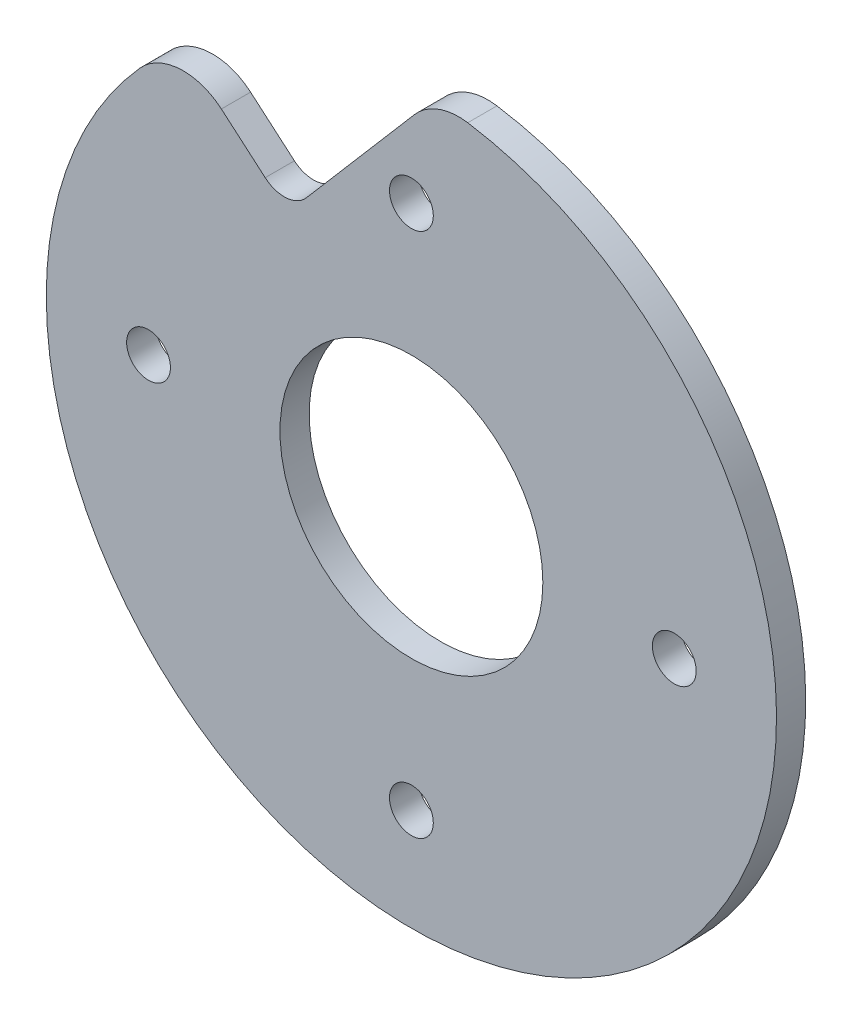
ISO-10303-21;
HEADER;
FILE_DESCRIPTION(('STEP AP214'),'2;1');
FILE_NAME('part.step','',(''),(''),'','','');
FILE_SCHEMA(('AUTOMOTIVE_DESIGN { 1 0 10303 214 1 1 1 1 }'));
ENDSEC;
DATA;
#1=APPLICATION_CONTEXT('core data for automotive mechanical design processes');
#2=APPLICATION_PROTOCOL_DEFINITION('international standard','automotive_design',2000,#1);
#3=PRODUCT_CONTEXT('',#1,'mechanical');
#4=PRODUCT('Part','Part','',(#3));
#5=PRODUCT_RELATED_PRODUCT_CATEGORY('part','',(#4));
#6=PRODUCT_DEFINITION_FORMATION('','',#4);
#7=PRODUCT_DEFINITION_CONTEXT('part definition',#1,'design');
#8=PRODUCT_DEFINITION('design','',#6,#7);
#9=PRODUCT_DEFINITION_SHAPE('','',#8);
#10=(LENGTH_UNIT() NAMED_UNIT(*) SI_UNIT(.MILLI.,.METRE.));
#11=(NAMED_UNIT(*) PLANE_ANGLE_UNIT() SI_UNIT($,.RADIAN.));
#12=(NAMED_UNIT(*) SI_UNIT($,.STERADIAN.) SOLID_ANGLE_UNIT());
#13=UNCERTAINTY_MEASURE_WITH_UNIT(LENGTH_MEASURE(1.E-05),#10,'distance_accuracy_value','');
#14=(GEOMETRIC_REPRESENTATION_CONTEXT(3) GLOBAL_UNCERTAINTY_ASSIGNED_CONTEXT((#13)) GLOBAL_UNIT_ASSIGNED_CONTEXT((#10,
#11,#12)) REPRESENTATION_CONTEXT('',''));
#15=CARTESIAN_POINT('',(0.,0.,0.));
#16=DIRECTION('',(0.,0.,1.));
#17=DIRECTION('',(1.,0.,0.));
#18=AXIS2_PLACEMENT_3D('',#15,#16,#17);
#19=CARTESIAN_POINT('',(-15.614621701814,14.0422074158317,2.));
#20=DIRECTION('',(0.,0.,1.));
#21=DIRECTION('',(1.,0.,0.));
#22=AXIS2_PLACEMENT_3D('',#19,#20,#21);
#23=PLANE('',#22);
#24=CARTESIAN_POINT('',(0.,18.,2.));
#25=DIRECTION('',(0.,0.,1.));
#26=DIRECTION('',(1.,0.,0.));
#27=AXIS2_PLACEMENT_3D('',#24,#25,#26);
#28=CIRCLE('',#27,1.5);
#29=CARTESIAN_POINT('',(1.5,18.,2.));
#30=VERTEX_POINT('',#29);
#31=EDGE_CURVE('E193',#30,#30,#28,.T.);
#32=ORIENTED_EDGE('',*,*,#31,.F.);
#33=EDGE_LOOP('',(#32));
#34=FACE_BOUND('',#33,.T.);
#35=CARTESIAN_POINT('',(18.,0.,2.));
#36=DIRECTION('',(0.,0.,1.));
#37=DIRECTION('',(1.,0.,0.));
#38=AXIS2_PLACEMENT_3D('',#35,#36,#37);
#39=CIRCLE('',#38,1.50000000000003);
#40=CARTESIAN_POINT('',(19.5,0.,2.));
#41=VERTEX_POINT('',#40);
#42=EDGE_CURVE('E205',#41,#41,#39,.T.);
#43=ORIENTED_EDGE('',*,*,#42,.F.);
#44=EDGE_LOOP('',(#43));
#45=FACE_BOUND('',#44,.T.);
#46=CARTESIAN_POINT('',(-15.614621701814,14.0422074158317,2.));
#47=DIRECTION('',(0.,0.,1.));
#48=DIRECTION('',(1.,0.,0.));
#49=AXIS2_PLACEMENT_3D('',#46,#47,#48);
#50=CIRCLE('',#49,4.);
#51=CARTESIAN_POINT('',(-13.0114883824099,17.0792614030713,2.));
#52=VERTEX_POINT('',#51);
#53=CARTESIAN_POINT('',(-18.5888353593024,16.7169135902758,2.));
#54=VERTEX_POINT('',#53);
#55=EDGE_CURVE('E129',#52,#54,#50,.T.);
#56=ORIENTED_EDGE('',*,*,#55,.T.);
#57=CARTESIAN_POINT('',(0.,0.,2.));
#58=DIRECTION('',(0.,0.,1.));
#59=DIRECTION('',(1.,0.,0.));
#60=AXIS2_PLACEMENT_3D('',#57,#58,#59);
#61=CIRCLE('',#60,25.);
#62=CARTESIAN_POINT('',(3.85745997564482,24.7006073313249,2.));
#63=VERTEX_POINT('',#62);
#64=EDGE_CURVE('E87',#54,#63,#61,.T.);
#65=ORIENTED_EDGE('',*,*,#64,.T.);
#66=CARTESIAN_POINT('',(3.24026637954127,20.748510158313,2.));
#67=DIRECTION('',(0.,0.,1.));
#68=DIRECTION('',(1.,0.,0.));
#69=AXIS2_PLACEMENT_3D('',#66,#67,#68);
#70=CIRCLE('',#69,3.99999999999999);
#71=CARTESIAN_POINT('',(0.203212392301789,23.3516434777173,2.));
#72=VERTEX_POINT('',#71);
#73=EDGE_CURVE('E100',#63,#72,#70,.T.);
#74=ORIENTED_EDGE('',*,*,#73,.T.);
#75=DIRECTION('',(-0.650783329851117,-0.759263496809831,0.));
#76=VECTOR('',#75,1.);
#77=CARTESIAN_POINT('',(0.20321239230179,23.3516434777173,2.));
#78=LINE('',#77,#76);
#79=CARTESIAN_POINT('',(-7.19118155298929,14.7246655786744,2.));
#80=VERTEX_POINT('',#79);
#81=EDGE_CURVE('E94',#72,#80,#78,.T.);
#82=ORIENTED_EDGE('',*,*,#81,.T.);
#83=CARTESIAN_POINT('',(-8.70970854660862,16.026232238377,2.));
#84=DIRECTION('',(0.,0.,-1.));
#85=DIRECTION('',(1.,0.,0.));
#86=AXIS2_PLACEMENT_3D('',#83,#84,#85);
#87=CIRCLE('',#86,1.99999999999999);
#88=CARTESIAN_POINT('',(-10.0112752063105,14.5077052447571,2.));
#89=VERTEX_POINT('',#88);
#90=EDGE_CURVE('E98',#80,#89,#87,.T.);
#91=ORIENTED_EDGE('',*,*,#90,.T.);
#92=DIRECTION('',(-0.759263496809929,0.650783329851003,0.));
#93=VECTOR('',#92,1.);
#94=CARTESIAN_POINT('',(-10.0112752063105,14.5077052447571,2.));
#95=LINE('',#94,#93);
#96=EDGE_CURVE('E50',#89,#52,#95,.T.);
#97=ORIENTED_EDGE('',*,*,#96,.T.);
#98=EDGE_LOOP('',(#56,#65,#74,#82,#91,#97));
#99=FACE_BOUND('',#98,.T.);
#100=CARTESIAN_POINT('',(-18.,0.,2.));
#101=DIRECTION('',(0.,0.,1.));
#102=DIRECTION('',(1.,0.,0.));
#103=AXIS2_PLACEMENT_3D('',#100,#101,#102);
#104=CIRCLE('',#103,1.5);
#105=CARTESIAN_POINT('',(-16.5,0.,2.));
#106=VERTEX_POINT('',#105);
#107=EDGE_CURVE('E122',#106,#106,#104,.T.);
#108=ORIENTED_EDGE('',*,*,#107,.F.);
#109=EDGE_LOOP('',(#108));
#110=FACE_BOUND('',#109,.T.);
#111=CARTESIAN_POINT('',(0.,0.,2.));
#112=DIRECTION('',(0.,0.,1.));
#113=DIRECTION('',(1.,0.,0.));
#114=AXIS2_PLACEMENT_3D('',#111,#112,#113);
#115=CIRCLE('',#114,9.);
#116=CARTESIAN_POINT('',(9.,0.,2.));
#117=VERTEX_POINT('',#116);
#118=EDGE_CURVE('E199',#117,#117,#115,.T.);
#119=ORIENTED_EDGE('',*,*,#118,.F.);
#120=EDGE_LOOP('',(#119));
#121=FACE_BOUND('',#120,.T.);
#122=CARTESIAN_POINT('',(0.,-18.,2.));
#123=DIRECTION('',(0.,0.,1.));
#124=DIRECTION('',(1.,0.,0.));
#125=AXIS2_PLACEMENT_3D('',#122,#123,#124);
#126=CIRCLE('',#125,1.5);
#127=CARTESIAN_POINT('',(1.5,-18.,2.));
#128=VERTEX_POINT('',#127);
#129=EDGE_CURVE('E184',#128,#128,#126,.T.);
#130=ORIENTED_EDGE('',*,*,#129,.F.);
#131=EDGE_LOOP('',(#130));
#132=FACE_BOUND('',#131,.T.);
#133=ADVANCED_FACE('F33',(#34,#45,#99,#110,#121,#132),#23,.T.);
#134=CARTESIAN_POINT('',(-15.614621701814,14.0422074158317,0.));
#135=DIRECTION('',(0.,0.,1.));
#136=DIRECTION('',(1.,0.,0.));
#137=AXIS2_PLACEMENT_3D('',#134,#135,#136);
#138=PLANE('',#137);
#139=CARTESIAN_POINT('',(-15.614621701814,14.0422074158317,0.));
#140=DIRECTION('',(0.,0.,1.));
#141=DIRECTION('',(1.,0.,0.));
#142=AXIS2_PLACEMENT_3D('',#139,#140,#141);
#143=CIRCLE('',#142,4.);
#144=CARTESIAN_POINT('',(-13.0114883824099,17.0792614030713,0.));
#145=VERTEX_POINT('',#144);
#146=CARTESIAN_POINT('',(-18.5888353593024,16.7169135902758,0.));
#147=VERTEX_POINT('',#146);
#148=EDGE_CURVE('E118',#145,#147,#143,.T.);
#149=ORIENTED_EDGE('',*,*,#148,.F.);
#150=DIRECTION('',(-0.759263496809929,0.650783329851003,0.));
#151=VECTOR('',#150,1.);
#152=CARTESIAN_POINT('',(-10.0112752063105,14.5077052447571,0.));
#153=LINE('',#152,#151);
#154=CARTESIAN_POINT('',(-10.0112752063105,14.5077052447571,0.));
#155=VERTEX_POINT('',#154);
#156=EDGE_CURVE('E79',#155,#145,#153,.T.);
#157=ORIENTED_EDGE('',*,*,#156,.F.);
#158=CARTESIAN_POINT('',(-8.70970854660862,16.026232238377,0.));
#159=DIRECTION('',(0.,0.,-1.));
#160=DIRECTION('',(1.,0.,0.));
#161=AXIS2_PLACEMENT_3D('',#158,#159,#160);
#162=CIRCLE('',#161,1.99999999999999);
#163=CARTESIAN_POINT('',(-7.19118155298929,14.7246655786744,0.));
#164=VERTEX_POINT('',#163);
#165=EDGE_CURVE('E73',#164,#155,#162,.T.);
#166=ORIENTED_EDGE('',*,*,#165,.F.);
#167=DIRECTION('',(-0.650783329851117,-0.759263496809831,0.));
#168=VECTOR('',#167,1.);
#169=CARTESIAN_POINT('',(0.20321239230179,23.3516434777173,0.));
#170=LINE('',#169,#168);
#171=CARTESIAN_POINT('',(0.203212392301789,23.3516434777173,0.));
#172=VERTEX_POINT('',#171);
#173=EDGE_CURVE('E108',#172,#164,#170,.T.);
#174=ORIENTED_EDGE('',*,*,#173,.F.);
#175=CARTESIAN_POINT('',(3.24026637954127,20.748510158313,0.));
#176=DIRECTION('',(0.,0.,1.));
#177=DIRECTION('',(1.,0.,0.));
#178=AXIS2_PLACEMENT_3D('',#175,#176,#177);
#179=CIRCLE('',#178,3.99999999999999);
#180=CARTESIAN_POINT('',(3.85745997564482,24.7006073313249,0.));
#181=VERTEX_POINT('',#180);
#182=EDGE_CURVE('E124',#181,#172,#179,.T.);
#183=ORIENTED_EDGE('',*,*,#182,.F.);
#184=CARTESIAN_POINT('',(0.,0.,0.));
#185=DIRECTION('',(0.,0.,1.));
#186=DIRECTION('',(1.,0.,0.));
#187=AXIS2_PLACEMENT_3D('',#184,#185,#186);
#188=CIRCLE('',#187,25.);
#189=EDGE_CURVE('E121',#147,#181,#188,.T.);
#190=ORIENTED_EDGE('',*,*,#189,.F.);
#191=EDGE_LOOP('',(#149,#157,#166,#174,#183,#190));
#192=FACE_BOUND('',#191,.T.);
#193=CARTESIAN_POINT('',(-18.,0.,0.));
#194=DIRECTION('',(0.,0.,1.));
#195=DIRECTION('',(1.,0.,0.));
#196=AXIS2_PLACEMENT_3D('',#193,#194,#195);
#197=CIRCLE('',#196,1.5);
#198=CARTESIAN_POINT('',(-16.5,0.,0.));
#199=VERTEX_POINT('',#198);
#200=EDGE_CURVE('E208',#199,#199,#197,.T.);
#201=ORIENTED_EDGE('',*,*,#200,.T.);
#202=EDGE_LOOP('',(#201));
#203=FACE_BOUND('',#202,.T.);
#204=CARTESIAN_POINT('',(18.,0.,0.));
#205=DIRECTION('',(0.,0.,1.));
#206=DIRECTION('',(1.,0.,0.));
#207=AXIS2_PLACEMENT_3D('',#204,#205,#206);
#208=CIRCLE('',#207,1.50000000000003);
#209=CARTESIAN_POINT('',(19.5,0.,0.));
#210=VERTEX_POINT('',#209);
#211=EDGE_CURVE('E202',#210,#210,#208,.T.);
#212=ORIENTED_EDGE('',*,*,#211,.T.);
#213=EDGE_LOOP('',(#212));
#214=FACE_BOUND('',#213,.T.);
#215=CARTESIAN_POINT('',(0.,0.,0.));
#216=DIRECTION('',(0.,0.,1.));
#217=DIRECTION('',(1.,0.,0.));
#218=AXIS2_PLACEMENT_3D('',#215,#216,#217);
#219=CIRCLE('',#218,9.);
#220=CARTESIAN_POINT('',(9.,0.,0.));
#221=VERTEX_POINT('',#220);
#222=EDGE_CURVE('E196',#221,#221,#219,.T.);
#223=ORIENTED_EDGE('',*,*,#222,.T.);
#224=EDGE_LOOP('',(#223));
#225=FACE_BOUND('',#224,.T.);
#226=CARTESIAN_POINT('',(0.,18.,0.));
#227=DIRECTION('',(0.,0.,1.));
#228=DIRECTION('',(1.,0.,0.));
#229=AXIS2_PLACEMENT_3D('',#226,#227,#228);
#230=CIRCLE('',#229,1.5);
#231=CARTESIAN_POINT('',(1.5,18.,0.));
#232=VERTEX_POINT('',#231);
#233=EDGE_CURVE('E190',#232,#232,#230,.T.);
#234=ORIENTED_EDGE('',*,*,#233,.T.);
#235=EDGE_LOOP('',(#234));
#236=FACE_BOUND('',#235,.T.);
#237=CARTESIAN_POINT('',(0.,-18.,0.));
#238=DIRECTION('',(0.,0.,1.));
#239=DIRECTION('',(1.,0.,0.));
#240=AXIS2_PLACEMENT_3D('',#237,#238,#239);
#241=CIRCLE('',#240,1.5);
#242=CARTESIAN_POINT('',(1.5,-18.,0.));
#243=VERTEX_POINT('',#242);
#244=EDGE_CURVE('E187',#243,#243,#241,.T.);
#245=ORIENTED_EDGE('',*,*,#244,.T.);
#246=EDGE_LOOP('',(#245));
#247=FACE_BOUND('',#246,.T.);
#248=ADVANCED_FACE('F138',(#192,#203,#214,#225,#236,#247),#138,.F.);
#249=CARTESIAN_POINT('',(-15.614621701814,14.0422074158317,2.));
#250=DIRECTION('',(0.,0.,-1.));
#251=DIRECTION('',(-1.,0.,0.));
#252=AXIS2_PLACEMENT_3D('',#249,#250,#251);
#253=CYLINDRICAL_SURFACE('',#252,4.);
#254=ORIENTED_EDGE('',*,*,#148,.T.);
#255=DIRECTION('',(0.,0.,-1.));
#256=VECTOR('',#255,1.);
#257=CARTESIAN_POINT('',(-18.5888353593024,16.7169135902758,2.));
#258=LINE('',#257,#256);
#259=EDGE_CURVE('E11',#54,#147,#258,.T.);
#260=ORIENTED_EDGE('',*,*,#259,.F.);
#261=ORIENTED_EDGE('',*,*,#55,.F.);
#262=DIRECTION('',(0.,0.,-1.));
#263=VECTOR('',#262,1.);
#264=CARTESIAN_POINT('',(-13.0114883824099,17.0792614030713,2.));
#265=LINE('',#264,#263);
#266=EDGE_CURVE('E114',#52,#145,#265,.T.);
#267=ORIENTED_EDGE('',*,*,#266,.T.);
#268=EDGE_LOOP('',(#254,#260,#261,#267));
#269=FACE_BOUND('',#268,.T.);
#270=ADVANCED_FACE('F35',(#269),#253,.T.);
#271=CARTESIAN_POINT('',(0.,0.,2.));
#272=DIRECTION('',(0.,0.,-1.));
#273=DIRECTION('',(-1.,0.,0.));
#274=AXIS2_PLACEMENT_3D('',#271,#272,#273);
#275=CYLINDRICAL_SURFACE('',#274,25.);
#276=ORIENTED_EDGE('',*,*,#189,.T.);
#277=DIRECTION('',(0.,0.,-1.));
#278=VECTOR('',#277,1.);
#279=CARTESIAN_POINT('',(3.85745997564482,24.7006073313249,2.));
#280=LINE('',#279,#278);
#281=EDGE_CURVE('E42',#63,#181,#280,.T.);
#282=ORIENTED_EDGE('',*,*,#281,.F.);
#283=ORIENTED_EDGE('',*,*,#64,.F.);
#284=ORIENTED_EDGE('',*,*,#259,.T.);
#285=EDGE_LOOP('',(#276,#282,#283,#284));
#286=FACE_BOUND('',#285,.T.);
#287=ADVANCED_FACE('F275',(#286),#275,.T.);
#288=CARTESIAN_POINT('',(3.24026637954127,20.748510158313,2.));
#289=DIRECTION('',(0.,0.,-1.));
#290=DIRECTION('',(-1.,0.,0.));
#291=AXIS2_PLACEMENT_3D('',#288,#289,#290);
#292=CYLINDRICAL_SURFACE('',#291,3.99999999999999);
#293=ORIENTED_EDGE('',*,*,#182,.T.);
#294=DIRECTION('',(0.,0.,-1.));
#295=VECTOR('',#294,1.);
#296=CARTESIAN_POINT('',(0.203212392301789,23.3516434777173,2.));
#297=LINE('',#296,#295);
#298=EDGE_CURVE('E109',#72,#172,#297,.T.);
#299=ORIENTED_EDGE('',*,*,#298,.F.);
#300=ORIENTED_EDGE('',*,*,#73,.F.);
#301=ORIENTED_EDGE('',*,*,#281,.T.);
#302=EDGE_LOOP('',(#293,#299,#300,#301));
#303=FACE_BOUND('',#302,.T.);
#304=ADVANCED_FACE('F135',(#303),#292,.T.);
#305=CARTESIAN_POINT('',(0.20321239230179,23.3516434777173,2.));
#306=DIRECTION('',(0.759263496809831,-0.650783329851117,0.));
#307=DIRECTION('',(0.650783329851117,0.759263496809831,0.));
#308=AXIS2_PLACEMENT_3D('',#305,#306,#307);
#309=PLANE('',#308);
#310=ORIENTED_EDGE('',*,*,#173,.T.);
#311=DIRECTION('',(0.,0.,-1.));
#312=VECTOR('',#311,1.);
#313=CARTESIAN_POINT('',(-7.19118155298929,14.7246655786744,2.));
#314=LINE('',#313,#312);
#315=EDGE_CURVE('E105',#80,#164,#314,.T.);
#316=ORIENTED_EDGE('',*,*,#315,.F.);
#317=ORIENTED_EDGE('',*,*,#81,.F.);
#318=ORIENTED_EDGE('',*,*,#298,.T.);
#319=EDGE_LOOP('',(#310,#316,#317,#318));
#320=FACE_BOUND('',#319,.T.);
#321=ADVANCED_FACE('F106',(#320),#309,.F.);
#322=CARTESIAN_POINT('',(-8.70970854660862,16.026232238377,2.));
#323=DIRECTION('',(0.,0.,-1.));
#324=DIRECTION('',(-1.,0.,0.));
#325=AXIS2_PLACEMENT_3D('',#322,#323,#324);
#326=CYLINDRICAL_SURFACE('',#325,1.99999999999999);
#327=ORIENTED_EDGE('',*,*,#165,.T.);
#328=DIRECTION('',(0.,0.,-1.));
#329=VECTOR('',#328,1.);
#330=CARTESIAN_POINT('',(-10.0112752063105,14.5077052447571,2.));
#331=LINE('',#330,#329);
#332=EDGE_CURVE('E110',#89,#155,#331,.T.);
#333=ORIENTED_EDGE('',*,*,#332,.F.);
#334=ORIENTED_EDGE('',*,*,#90,.F.);
#335=ORIENTED_EDGE('',*,*,#315,.T.);
#336=EDGE_LOOP('',(#327,#333,#334,#335));
#337=FACE_BOUND('',#336,.T.);
#338=ADVANCED_FACE('F112',(#337),#326,.F.);
#339=CARTESIAN_POINT('',(-10.0112752063105,14.5077052447571,2.));
#340=DIRECTION('',(-0.650783329851003,-0.759263496809929,0.));
#341=DIRECTION('',(0.759263496809929,-0.650783329851003,0.));
#342=AXIS2_PLACEMENT_3D('',#339,#340,#341);
#343=PLANE('',#342);
#344=ORIENTED_EDGE('',*,*,#156,.T.);
#345=ORIENTED_EDGE('',*,*,#266,.F.);
#346=ORIENTED_EDGE('',*,*,#96,.F.);
#347=ORIENTED_EDGE('',*,*,#332,.T.);
#348=EDGE_LOOP('',(#344,#345,#346,#347));
#349=FACE_BOUND('',#348,.T.);
#350=ADVANCED_FACE('F143',(#349),#343,.F.);
#351=CARTESIAN_POINT('',(-18.,0.,2.));
#352=DIRECTION('',(0.,0.,-1.));
#353=DIRECTION('',(-1.,0.,0.));
#354=AXIS2_PLACEMENT_3D('',#351,#352,#353);
#355=CYLINDRICAL_SURFACE('',#354,1.5);
#356=ORIENTED_EDGE('',*,*,#107,.T.);
#357=EDGE_LOOP('',(#356));
#358=FACE_BOUND('',#357,.T.);
#359=ORIENTED_EDGE('',*,*,#200,.F.);
#360=EDGE_LOOP('',(#359));
#361=FACE_BOUND('',#360,.T.);
#362=ADVANCED_FACE('F145',(#358,#361),#355,.F.);
#363=CARTESIAN_POINT('',(18.,0.,2.));
#364=DIRECTION('',(0.,0.,-1.));
#365=DIRECTION('',(-1.,0.,0.));
#366=AXIS2_PLACEMENT_3D('',#363,#364,#365);
#367=CYLINDRICAL_SURFACE('',#366,1.50000000000003);
#368=ORIENTED_EDGE('',*,*,#42,.T.);
#369=EDGE_LOOP('',(#368));
#370=FACE_BOUND('',#369,.T.);
#371=ORIENTED_EDGE('',*,*,#211,.F.);
#372=EDGE_LOOP('',(#371));
#373=FACE_BOUND('',#372,.T.);
#374=ADVANCED_FACE('F151',(#370,#373),#367,.F.);
#375=CARTESIAN_POINT('',(0.,0.,2.));
#376=DIRECTION('',(0.,0.,-1.));
#377=DIRECTION('',(-1.,0.,0.));
#378=AXIS2_PLACEMENT_3D('',#375,#376,#377);
#379=CYLINDRICAL_SURFACE('',#378,9.);
#380=ORIENTED_EDGE('',*,*,#118,.T.);
#381=EDGE_LOOP('',(#380));
#382=FACE_BOUND('',#381,.T.);
#383=ORIENTED_EDGE('',*,*,#222,.F.);
#384=EDGE_LOOP('',(#383));
#385=FACE_BOUND('',#384,.T.);
#386=ADVANCED_FACE('F167',(#382,#385),#379,.F.);
#387=CARTESIAN_POINT('',(0.,18.,2.));
#388=DIRECTION('',(0.,0.,-1.));
#389=DIRECTION('',(-1.,0.,0.));
#390=AXIS2_PLACEMENT_3D('',#387,#388,#389);
#391=CYLINDRICAL_SURFACE('',#390,1.5);
#392=ORIENTED_EDGE('',*,*,#31,.T.);
#393=EDGE_LOOP('',(#392));
#394=FACE_BOUND('',#393,.T.);
#395=ORIENTED_EDGE('',*,*,#233,.F.);
#396=EDGE_LOOP('',(#395));
#397=FACE_BOUND('',#396,.T.);
#398=ADVANCED_FACE('F171',(#394,#397),#391,.F.);
#399=CARTESIAN_POINT('',(0.,-18.,2.));
#400=DIRECTION('',(0.,0.,-1.));
#401=DIRECTION('',(-1.,0.,0.));
#402=AXIS2_PLACEMENT_3D('',#399,#400,#401);
#403=CYLINDRICAL_SURFACE('',#402,1.5);
#404=ORIENTED_EDGE('',*,*,#129,.T.);
#405=EDGE_LOOP('',(#404));
#406=FACE_BOUND('',#405,.T.);
#407=ORIENTED_EDGE('',*,*,#244,.F.);
#408=EDGE_LOOP('',(#407));
#409=FACE_BOUND('',#408,.T.);
#410=ADVANCED_FACE('F175',(#406,#409),#403,.F.);
#411=CLOSED_SHELL('',(#133,#248,#270,#287,#304,#321,#338,#350,#362,#374,#386,#398,#410));
#412=MANIFOLD_SOLID_BREP('B2',#411);
#413=ADVANCED_BREP_SHAPE_REPRESENTATION('',(#18,#412),#14);
#414=SHAPE_DEFINITION_REPRESENTATION(#9,#413);
ENDSEC;
END-ISO-10303-21;
